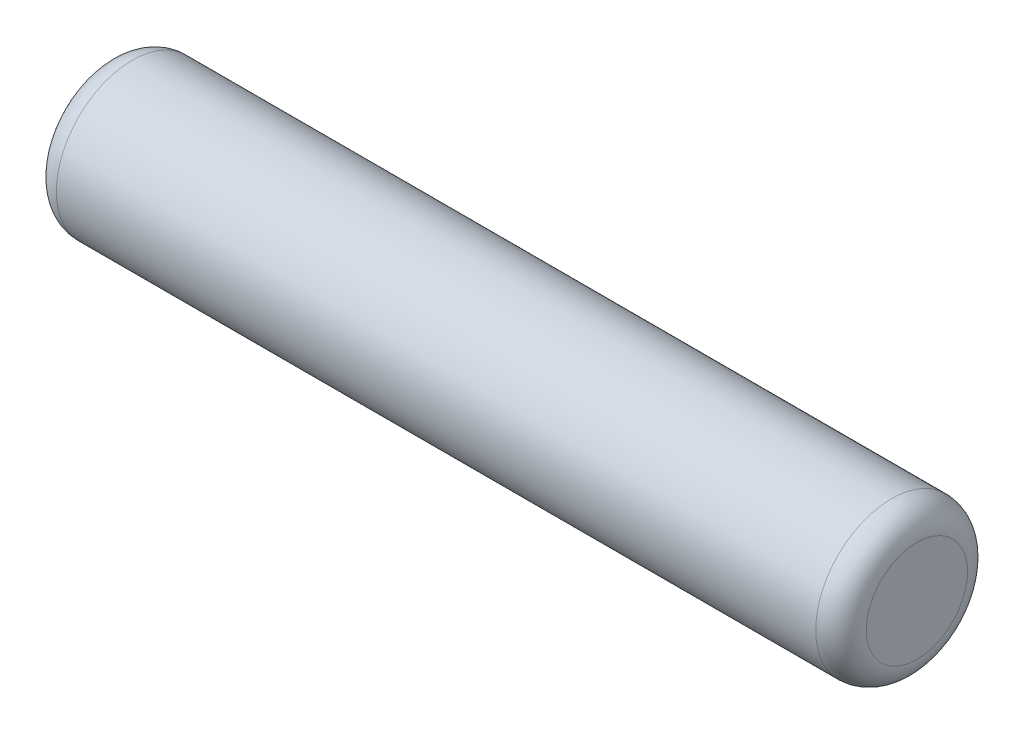
ISO-10303-21;
HEADER;
FILE_DESCRIPTION(('STEP AP214'),'2;1');
FILE_NAME('part.step','',(''),(''),'','','');
FILE_SCHEMA(('AUTOMOTIVE_DESIGN { 1 0 10303 214 1 1 1 1 }'));
ENDSEC;
DATA;
#1=APPLICATION_CONTEXT('core data for automotive mechanical design processes');
#2=APPLICATION_PROTOCOL_DEFINITION('international standard','automotive_design',2000,#1);
#3=PRODUCT_CONTEXT('',#1,'mechanical');
#4=PRODUCT('Part','Part','',(#3));
#5=PRODUCT_RELATED_PRODUCT_CATEGORY('part','',(#4));
#6=PRODUCT_DEFINITION_FORMATION('','',#4);
#7=PRODUCT_DEFINITION_CONTEXT('part definition',#1,'design');
#8=PRODUCT_DEFINITION('design','',#6,#7);
#9=PRODUCT_DEFINITION_SHAPE('','',#8);
#10=(LENGTH_UNIT() NAMED_UNIT(*) SI_UNIT(.MILLI.,.METRE.));
#11=(NAMED_UNIT(*) PLANE_ANGLE_UNIT() SI_UNIT($,.RADIAN.));
#12=(NAMED_UNIT(*) SI_UNIT($,.STERADIAN.) SOLID_ANGLE_UNIT());
#13=UNCERTAINTY_MEASURE_WITH_UNIT(LENGTH_MEASURE(1.E-05),#10,'distance_accuracy_value','');
#14=(GEOMETRIC_REPRESENTATION_CONTEXT(3) GLOBAL_UNCERTAINTY_ASSIGNED_CONTEXT((#13)) GLOBAL_UNIT_ASSIGNED_CONTEXT((#10,
#11,#12)) REPRESENTATION_CONTEXT('',''));
#15=CARTESIAN_POINT('',(0.,0.,0.));
#16=DIRECTION('',(0.,0.,1.));
#17=DIRECTION('',(1.,0.,0.));
#18=AXIS2_PLACEMENT_3D('',#15,#16,#17);
#19=CARTESIAN_POINT('',(16.,0.,0.));
#20=DIRECTION('',(-1.,0.,0.));
#21=DIRECTION('',(0.,0.,1.));
#22=AXIS2_PLACEMENT_3D('',#19,#20,#21);
#23=CYLINDRICAL_SURFACE('',#22,1.5);
#24=CARTESIAN_POINT('',(15.5,0.,0.));
#25=DIRECTION('',(1.,0.,0.));
#26=DIRECTION('',(0.,0.,-1.));
#27=AXIS2_PLACEMENT_3D('',#24,#25,#26);
#28=CIRCLE('',#27,1.5);
#29=CARTESIAN_POINT('',(15.5,0.,-1.5));
#30=VERTEX_POINT('',#29);
#31=EDGE_CURVE('E41',#30,#30,#28,.F.);
#32=ORIENTED_EDGE('',*,*,#31,.T.);
#33=EDGE_LOOP('',(#32));
#34=FACE_BOUND('',#33,.T.);
#35=CARTESIAN_POINT('',(0.5,0.,0.));
#36=DIRECTION('',(1.,0.,0.));
#37=DIRECTION('',(0.,0.,-1.));
#38=AXIS2_PLACEMENT_3D('',#35,#36,#37);
#39=CIRCLE('',#38,1.5);
#40=CARTESIAN_POINT('',(0.5,0.,-1.5));
#41=VERTEX_POINT('',#40);
#42=EDGE_CURVE('E45',#41,#41,#39,.T.);
#43=ORIENTED_EDGE('',*,*,#42,.T.);
#44=EDGE_LOOP('',(#43));
#45=FACE_BOUND('',#44,.T.);
#46=ADVANCED_FACE('F34',(#34,#45),#23,.T.);
#47=CARTESIAN_POINT('',(16.,0.,0.));
#48=DIRECTION('',(1.,0.,0.));
#49=DIRECTION('',(0.,0.,-1.));
#50=AXIS2_PLACEMENT_3D('',#47,#48,#49);
#51=PLANE('',#50);
#52=CARTESIAN_POINT('',(16.,0.,0.));
#53=DIRECTION('',(1.,0.,0.));
#54=DIRECTION('',(0.,0.,-1.));
#55=AXIS2_PLACEMENT_3D('',#52,#53,#54);
#56=CIRCLE('',#55,1.);
#57=CARTESIAN_POINT('',(16.,0.,-1.));
#58=VERTEX_POINT('',#57);
#59=EDGE_CURVE('E49',#58,#58,#56,.T.);
#60=ORIENTED_EDGE('',*,*,#59,.T.);
#61=EDGE_LOOP('',(#60));
#62=FACE_BOUND('',#61,.T.);
#63=ADVANCED_FACE('F55',(#62),#51,.T.);
#64=CARTESIAN_POINT('',(0.,0.,0.));
#65=DIRECTION('',(1.,0.,0.));
#66=DIRECTION('',(0.,0.,-1.));
#67=AXIS2_PLACEMENT_3D('',#64,#65,#66);
#68=PLANE('',#67);
#69=CARTESIAN_POINT('',(0.,0.,0.));
#70=DIRECTION('',(1.,0.,0.));
#71=DIRECTION('',(0.,0.,-1.));
#72=AXIS2_PLACEMENT_3D('',#69,#70,#71);
#73=CIRCLE('',#72,1.);
#74=CARTESIAN_POINT('',(0.,0.,-1.));
#75=VERTEX_POINT('',#74);
#76=EDGE_CURVE('E10',#75,#75,#73,.F.);
#77=ORIENTED_EDGE('',*,*,#76,.T.);
#78=EDGE_LOOP('',(#77));
#79=FACE_BOUND('',#78,.T.);
#80=ADVANCED_FACE('F59',(#79),#68,.F.);
#81=CARTESIAN_POINT('',(15.5,0.,0.));
#82=DIRECTION('',(1.,0.,0.));
#83=DIRECTION('',(0.,0.,-1.));
#84=AXIS2_PLACEMENT_3D('',#81,#82,#83);
#85=TOROIDAL_SURFACE('',#84,1.,0.5);
#86=ORIENTED_EDGE('',*,*,#31,.F.);
#87=EDGE_LOOP('',(#86));
#88=FACE_BOUND('',#87,.T.);
#89=ORIENTED_EDGE('',*,*,#59,.F.);
#90=EDGE_LOOP('',(#89));
#91=FACE_BOUND('',#90,.T.);
#92=ADVANCED_FACE('F57',(#88,#91),#85,.T.);
#93=CARTESIAN_POINT('',(0.5,0.,0.));
#94=DIRECTION('',(1.,0.,0.));
#95=DIRECTION('',(0.,0.,-1.));
#96=AXIS2_PLACEMENT_3D('',#93,#94,#95);
#97=TOROIDAL_SURFACE('',#96,1.,0.5);
#98=ORIENTED_EDGE('',*,*,#76,.F.);
#99=EDGE_LOOP('',(#98));
#100=FACE_BOUND('',#99,.T.);
#101=ORIENTED_EDGE('',*,*,#42,.F.);
#102=EDGE_LOOP('',(#101));
#103=FACE_BOUND('',#102,.T.);
#104=ADVANCED_FACE('F36',(#100,#103),#97,.T.);
#105=CLOSED_SHELL('',(#46,#63,#80,#92,#104));
#106=MANIFOLD_SOLID_BREP('B2',#105);
#107=ADVANCED_BREP_SHAPE_REPRESENTATION('',(#18,#106),#14);
#108=SHAPE_DEFINITION_REPRESENTATION(#9,#107);
ENDSEC;
END-ISO-10303-21;
